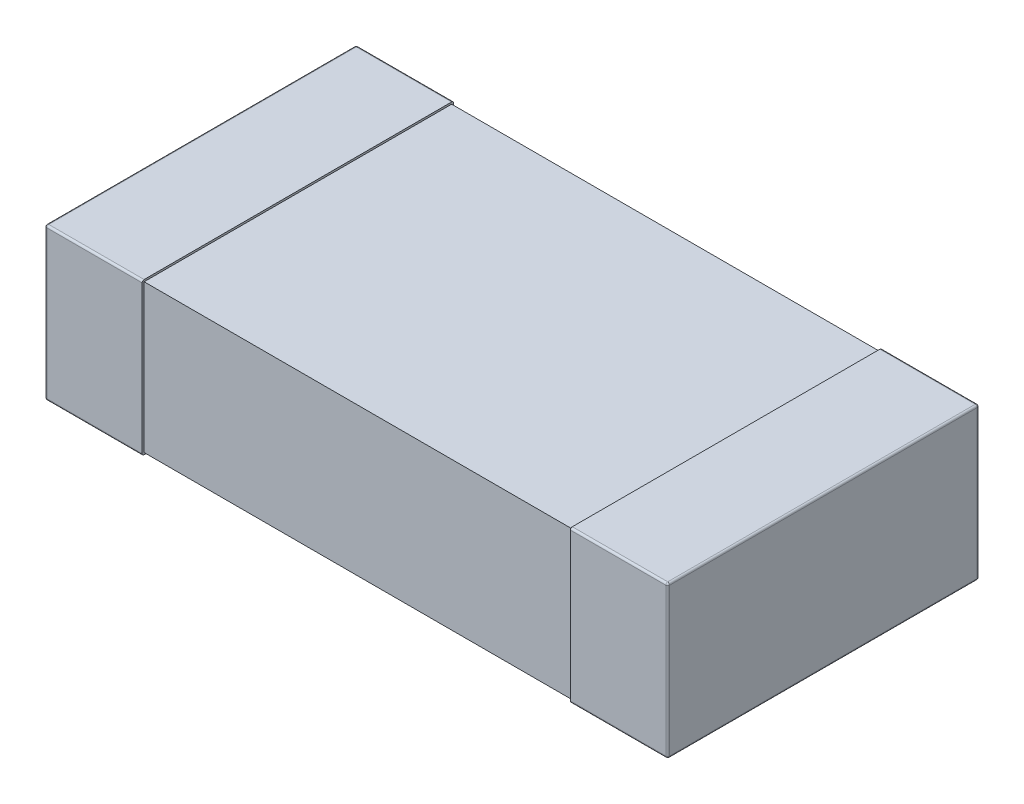
ISO-10303-21;
HEADER;
FILE_DESCRIPTION(('STEP AP214'),'2;1');
FILE_NAME('part.step','',(''),(''),'','','');
FILE_SCHEMA(('AUTOMOTIVE_DESIGN { 1 0 10303 214 1 1 1 1 }'));
ENDSEC;
DATA;
#1=APPLICATION_CONTEXT('core data for automotive mechanical design processes');
#2=APPLICATION_PROTOCOL_DEFINITION('international standard','automotive_design',2000,#1);
#3=PRODUCT_CONTEXT('',#1,'mechanical');
#4=PRODUCT('Part','Part','',(#3));
#5=PRODUCT_RELATED_PRODUCT_CATEGORY('part','',(#4));
#6=PRODUCT_DEFINITION_FORMATION('','',#4);
#7=PRODUCT_DEFINITION_CONTEXT('part definition',#1,'design');
#8=PRODUCT_DEFINITION('design','',#6,#7);
#9=PRODUCT_DEFINITION_SHAPE('','',#8);
#10=(LENGTH_UNIT() NAMED_UNIT(*) SI_UNIT(.MILLI.,.METRE.));
#11=(NAMED_UNIT(*) PLANE_ANGLE_UNIT() SI_UNIT($,.RADIAN.));
#12=(NAMED_UNIT(*) SI_UNIT($,.STERADIAN.) SOLID_ANGLE_UNIT());
#13=UNCERTAINTY_MEASURE_WITH_UNIT(LENGTH_MEASURE(1.E-05),#10,'distance_accuracy_value','');
#14=(GEOMETRIC_REPRESENTATION_CONTEXT(3) GLOBAL_UNCERTAINTY_ASSIGNED_CONTEXT((#13)) GLOBAL_UNIT_ASSIGNED_CONTEXT((#10,
#11,#12)) REPRESENTATION_CONTEXT('',''));
#15=CARTESIAN_POINT('',(0.,0.,0.));
#16=DIRECTION('',(0.,0.,1.));
#17=DIRECTION('',(1.,0.,0.));
#18=AXIS2_PLACEMENT_3D('',#15,#16,#17);
#19=CARTESIAN_POINT('',(-1.6,0.39,-0.8));
#20=DIRECTION('',(1.,0.,0.));
#21=DIRECTION('',(0.,0.,-1.));
#22=AXIS2_PLACEMENT_3D('',#19,#20,#21);
#23=PLANE('',#22);
#24=DIRECTION('',(0.,-1.,0.));
#25=VECTOR('',#24,1.);
#26=CARTESIAN_POINT('',(-1.6,0.39,-0.79));
#27=LINE('',#26,#25);
#28=CARTESIAN_POINT('',(-1.6,0.38,-0.79));
#29=VERTEX_POINT('',#28);
#30=CARTESIAN_POINT('',(-1.6,-0.38,-0.79));
#31=VERTEX_POINT('',#30);
#32=EDGE_CURVE('E11',#29,#31,#27,.T.);
#33=ORIENTED_EDGE('',*,*,#32,.T.);
#34=DIRECTION('',(0.,0.,1.));
#35=VECTOR('',#34,1.);
#36=CARTESIAN_POINT('',(-1.6,-0.38,-0.8));
#37=LINE('',#36,#35);
#38=CARTESIAN_POINT('',(-1.6,-0.38,0.79));
#39=VERTEX_POINT('',#38);
#40=EDGE_CURVE('E24',#31,#39,#37,.T.);
#41=ORIENTED_EDGE('',*,*,#40,.T.);
#42=DIRECTION('',(0.,1.,0.));
#43=VECTOR('',#42,1.);
#44=CARTESIAN_POINT('',(-1.6,0.39,0.79));
#45=LINE('',#44,#43);
#46=CARTESIAN_POINT('',(-1.6,0.38,0.79));
#47=VERTEX_POINT('',#46);
#48=EDGE_CURVE('E407',#39,#47,#45,.T.);
#49=ORIENTED_EDGE('',*,*,#48,.T.);
#50=DIRECTION('',(0.,0.,-1.));
#51=VECTOR('',#50,1.);
#52=CARTESIAN_POINT('',(-1.6,0.38,-0.8));
#53=LINE('',#52,#51);
#54=EDGE_CURVE('E405',#47,#29,#53,.T.);
#55=ORIENTED_EDGE('',*,*,#54,.T.);
#56=EDGE_LOOP('',(#33,#41,#49,#55));
#57=FACE_BOUND('',#56,.T.);
#58=ADVANCED_FACE('F17',(#57),#23,.F.);
#59=CARTESIAN_POINT('',(-1.6,0.39,0.8));
#60=DIRECTION('',(0.,0.,-1.));
#61=DIRECTION('',(-1.,0.,0.));
#62=AXIS2_PLACEMENT_3D('',#59,#60,#61);
#63=PLANE('',#62);
#64=DIRECTION('',(0.,-1.,0.));
#65=VECTOR('',#64,1.);
#66=CARTESIAN_POINT('',(-1.59,0.39,0.8));
#67=LINE('',#66,#65);
#68=CARTESIAN_POINT('',(-1.59,0.38,0.8));
#69=VERTEX_POINT('',#68);
#70=CARTESIAN_POINT('',(-1.59,-0.38,0.8));
#71=VERTEX_POINT('',#70);
#72=EDGE_CURVE('E403',#69,#71,#67,.T.);
#73=ORIENTED_EDGE('',*,*,#72,.T.);
#74=DIRECTION('',(1.,0.,0.));
#75=VECTOR('',#74,1.);
#76=CARTESIAN_POINT('',(-1.6,-0.38,0.8));
#77=LINE('',#76,#75);
#78=CARTESIAN_POINT('',(-1.1,-0.38,0.8));
#79=VERTEX_POINT('',#78);
#80=EDGE_CURVE('E401',#71,#79,#77,.T.);
#81=ORIENTED_EDGE('',*,*,#80,.T.);
#82=DIRECTION('',(0.,-1.,0.));
#83=VECTOR('',#82,1.);
#84=CARTESIAN_POINT('',(-1.1,0.39,0.8));
#85=LINE('',#84,#83);
#86=CARTESIAN_POINT('',(-1.1,0.38,0.8));
#87=VERTEX_POINT('',#86);
#88=EDGE_CURVE('E398',#87,#79,#85,.T.);
#89=ORIENTED_EDGE('',*,*,#88,.F.);
#90=DIRECTION('',(-1.,0.,0.));
#91=VECTOR('',#90,1.);
#92=CARTESIAN_POINT('',(-1.6,0.38,0.8));
#93=LINE('',#92,#91);
#94=EDGE_CURVE('E395',#87,#69,#93,.T.);
#95=ORIENTED_EDGE('',*,*,#94,.T.);
#96=EDGE_LOOP('',(#73,#81,#89,#95));
#97=FACE_BOUND('',#96,.T.);
#98=ADVANCED_FACE('F430',(#97),#63,.F.);
#99=CARTESIAN_POINT('',(-1.1,0.39,-0.8));
#100=DIRECTION('',(-1.,0.,0.));
#101=DIRECTION('',(0.,0.,1.));
#102=AXIS2_PLACEMENT_3D('',#99,#100,#101);
#103=PLANE('',#102);
#104=DIRECTION('',(0.,1.,0.));
#105=VECTOR('',#104,1.);
#106=CARTESIAN_POINT('',(-1.1,0.38,-0.79));
#107=LINE('',#106,#105);
#108=CARTESIAN_POINT('',(-1.1,-0.38,-0.79));
#109=VERTEX_POINT('',#108);
#110=CARTESIAN_POINT('',(-1.1,0.38,-0.79));
#111=VERTEX_POINT('',#110);
#112=EDGE_CURVE('E393',#109,#111,#107,.T.);
#113=ORIENTED_EDGE('',*,*,#112,.F.);
#114=DIRECTION('',(0.,0.,-1.));
#115=VECTOR('',#114,1.);
#116=CARTESIAN_POINT('',(-1.1,-0.38,0.79));
#117=LINE('',#116,#115);
#118=CARTESIAN_POINT('',(-1.1,-0.38,0.79));
#119=VERTEX_POINT('',#118);
#120=EDGE_CURVE('E390',#119,#109,#117,.T.);
#121=ORIENTED_EDGE('',*,*,#120,.F.);
#122=DIRECTION('',(0.,-1.,0.));
#123=VECTOR('',#122,1.);
#124=CARTESIAN_POINT('',(-1.1,0.38,0.79));
#125=LINE('',#124,#123);
#126=CARTESIAN_POINT('',(-1.1,0.38,0.79));
#127=VERTEX_POINT('',#126);
#128=EDGE_CURVE('E387',#127,#119,#125,.T.);
#129=ORIENTED_EDGE('',*,*,#128,.F.);
#130=DIRECTION('',(0.,0.,1.));
#131=VECTOR('',#130,1.);
#132=CARTESIAN_POINT('',(-1.1,0.38,0.79));
#133=LINE('',#132,#131);
#134=EDGE_CURVE('E384',#111,#127,#133,.T.);
#135=ORIENTED_EDGE('',*,*,#134,.F.);
#136=EDGE_LOOP('',(#113,#121,#129,#135));
#137=FACE_BOUND('',#136,.T.);
#138=DIRECTION('',(0.,0.,-1.));
#139=VECTOR('',#138,1.);
#140=CARTESIAN_POINT('',(-1.1,-0.39,-0.8));
#141=LINE('',#140,#139);
#142=CARTESIAN_POINT('',(-1.1,-0.39,0.79));
#143=VERTEX_POINT('',#142);
#144=CARTESIAN_POINT('',(-1.1,-0.39,-0.79));
#145=VERTEX_POINT('',#144);
#146=EDGE_CURVE('E382',#143,#145,#141,.T.);
#147=ORIENTED_EDGE('',*,*,#146,.T.);
#148=CARTESIAN_POINT('',(-1.1,-0.38,-0.79));
#149=DIRECTION('',(1.,0.,0.));
#150=DIRECTION('',(0.,0.,1.));
#151=AXIS2_PLACEMENT_3D('',#148,#149,#150);
#152=CIRCLE('',#151,0.01);
#153=CARTESIAN_POINT('',(-1.1,-0.38,-0.8));
#154=VERTEX_POINT('',#153);
#155=EDGE_CURVE('E380',#145,#154,#152,.T.);
#156=ORIENTED_EDGE('',*,*,#155,.T.);
#157=DIRECTION('',(0.,-1.,0.));
#158=VECTOR('',#157,1.);
#159=CARTESIAN_POINT('',(-1.1,0.39,-0.8));
#160=LINE('',#159,#158);
#161=CARTESIAN_POINT('',(-1.1,0.38,-0.8));
#162=VERTEX_POINT('',#161);
#163=EDGE_CURVE('E377',#162,#154,#160,.T.);
#164=ORIENTED_EDGE('',*,*,#163,.F.);
#165=CARTESIAN_POINT('',(-1.1,0.38,-0.79));
#166=DIRECTION('',(1.,0.,0.));
#167=DIRECTION('',(0.,0.,1.));
#168=AXIS2_PLACEMENT_3D('',#165,#166,#167);
#169=CIRCLE('',#168,0.01);
#170=CARTESIAN_POINT('',(-1.1,0.39,-0.79));
#171=VERTEX_POINT('',#170);
#172=EDGE_CURVE('E375',#162,#171,#169,.T.);
#173=ORIENTED_EDGE('',*,*,#172,.T.);
#174=DIRECTION('',(0.,0.,-1.));
#175=VECTOR('',#174,1.);
#176=CARTESIAN_POINT('',(-1.1,0.39,-0.8));
#177=LINE('',#176,#175);
#178=CARTESIAN_POINT('',(-1.1,0.39,0.79));
#179=VERTEX_POINT('',#178);
#180=EDGE_CURVE('E372',#179,#171,#177,.T.);
#181=ORIENTED_EDGE('',*,*,#180,.F.);
#182=CARTESIAN_POINT('',(-1.1,0.38,0.79));
#183=DIRECTION('',(1.,0.,0.));
#184=DIRECTION('',(0.,0.,1.));
#185=AXIS2_PLACEMENT_3D('',#182,#183,#184);
#186=CIRCLE('',#185,0.01);
#187=EDGE_CURVE('E369',#179,#87,#186,.T.);
#188=ORIENTED_EDGE('',*,*,#187,.T.);
#189=ORIENTED_EDGE('',*,*,#88,.T.);
#190=CARTESIAN_POINT('',(-1.1,-0.38,0.79));
#191=DIRECTION('',(1.,0.,0.));
#192=DIRECTION('',(0.,0.,1.));
#193=AXIS2_PLACEMENT_3D('',#190,#191,#192);
#194=CIRCLE('',#193,0.01);
#195=EDGE_CURVE('E366',#79,#143,#194,.T.);
#196=ORIENTED_EDGE('',*,*,#195,.T.);
#197=EDGE_LOOP('',(#147,#156,#164,#173,#181,#188,#189,#196));
#198=FACE_BOUND('',#197,.T.);
#199=ADVANCED_FACE('F433',(#137,#198),#103,.F.);
#200=CARTESIAN_POINT('',(-1.6,0.39,-0.8));
#201=DIRECTION('',(0.,0.,1.));
#202=DIRECTION('',(1.,0.,0.));
#203=AXIS2_PLACEMENT_3D('',#200,#201,#202);
#204=PLANE('',#203);
#205=ORIENTED_EDGE('',*,*,#163,.T.);
#206=DIRECTION('',(-1.,0.,0.));
#207=VECTOR('',#206,1.);
#208=CARTESIAN_POINT('',(-1.6,-0.38,-0.8));
#209=LINE('',#208,#207);
#210=CARTESIAN_POINT('',(-1.59,-0.38,-0.8));
#211=VERTEX_POINT('',#210);
#212=EDGE_CURVE('E364',#154,#211,#209,.T.);
#213=ORIENTED_EDGE('',*,*,#212,.T.);
#214=DIRECTION('',(0.,1.,0.));
#215=VECTOR('',#214,1.);
#216=CARTESIAN_POINT('',(-1.59,0.39,-0.8));
#217=LINE('',#216,#215);
#218=CARTESIAN_POINT('',(-1.59,0.38,-0.8));
#219=VERTEX_POINT('',#218);
#220=EDGE_CURVE('E362',#211,#219,#217,.T.);
#221=ORIENTED_EDGE('',*,*,#220,.T.);
#222=DIRECTION('',(1.,0.,0.));
#223=VECTOR('',#222,1.);
#224=CARTESIAN_POINT('',(-1.1,0.38,-0.8));
#225=LINE('',#224,#223);
#226=EDGE_CURVE('E359',#219,#162,#225,.T.);
#227=ORIENTED_EDGE('',*,*,#226,.T.);
#228=EDGE_LOOP('',(#205,#213,#221,#227));
#229=FACE_BOUND('',#228,.T.);
#230=ADVANCED_FACE('F481',(#229),#204,.F.);
#231=CARTESIAN_POINT('',(-1.6,0.39,0.8));
#232=DIRECTION('',(0.,1.,0.));
#233=DIRECTION('',(0.,0.,1.));
#234=AXIS2_PLACEMENT_3D('',#231,#232,#233);
#235=PLANE('',#234);
#236=ORIENTED_EDGE('',*,*,#180,.T.);
#237=DIRECTION('',(-1.,0.,0.));
#238=VECTOR('',#237,1.);
#239=CARTESIAN_POINT('',(-1.6,0.39,-0.79));
#240=LINE('',#239,#238);
#241=CARTESIAN_POINT('',(-1.59,0.39,-0.79));
#242=VERTEX_POINT('',#241);
#243=EDGE_CURVE('E357',#171,#242,#240,.T.);
#244=ORIENTED_EDGE('',*,*,#243,.T.);
#245=DIRECTION('',(0.,0.,1.));
#246=VECTOR('',#245,1.);
#247=CARTESIAN_POINT('',(-1.59,0.39,0.8));
#248=LINE('',#247,#246);
#249=CARTESIAN_POINT('',(-1.59,0.39,0.79));
#250=VERTEX_POINT('',#249);
#251=EDGE_CURVE('E355',#242,#250,#248,.T.);
#252=ORIENTED_EDGE('',*,*,#251,.T.);
#253=DIRECTION('',(1.,0.,0.));
#254=VECTOR('',#253,1.);
#255=CARTESIAN_POINT('',(-1.1,0.39,0.79));
#256=LINE('',#255,#254);
#257=EDGE_CURVE('E352',#250,#179,#256,.T.);
#258=ORIENTED_EDGE('',*,*,#257,.T.);
#259=EDGE_LOOP('',(#236,#244,#252,#258));
#260=FACE_BOUND('',#259,.T.);
#261=ADVANCED_FACE('F441',(#260),#235,.T.);
#262=CARTESIAN_POINT('',(-1.6,-0.39,0.8));
#263=DIRECTION('',(0.,1.,0.));
#264=DIRECTION('',(0.,0.,1.));
#265=AXIS2_PLACEMENT_3D('',#262,#263,#264);
#266=PLANE('',#265);
#267=DIRECTION('',(0.,0.,-1.));
#268=VECTOR('',#267,1.);
#269=CARTESIAN_POINT('',(-1.59,-0.39,0.8));
#270=LINE('',#269,#268);
#271=CARTESIAN_POINT('',(-1.59,-0.39,0.79));
#272=VERTEX_POINT('',#271);
#273=CARTESIAN_POINT('',(-1.59,-0.39,-0.79));
#274=VERTEX_POINT('',#273);
#275=EDGE_CURVE('E350',#272,#274,#270,.T.);
#276=ORIENTED_EDGE('',*,*,#275,.T.);
#277=DIRECTION('',(1.,0.,0.));
#278=VECTOR('',#277,1.);
#279=CARTESIAN_POINT('',(-1.6,-0.39,-0.79));
#280=LINE('',#279,#278);
#281=EDGE_CURVE('E347',#274,#145,#280,.T.);
#282=ORIENTED_EDGE('',*,*,#281,.T.);
#283=ORIENTED_EDGE('',*,*,#146,.F.);
#284=DIRECTION('',(-1.,0.,0.));
#285=VECTOR('',#284,1.);
#286=CARTESIAN_POINT('',(-1.6,-0.39,0.79));
#287=LINE('',#286,#285);
#288=EDGE_CURVE('E344',#143,#272,#287,.T.);
#289=ORIENTED_EDGE('',*,*,#288,.T.);
#290=EDGE_LOOP('',(#276,#282,#283,#289));
#291=FACE_BOUND('',#290,.T.);
#292=ADVANCED_FACE('F424',(#291),#266,.F.);
#293=CARTESIAN_POINT('',(-1.6,0.38,-0.79));
#294=DIRECTION('',(1.,0.,0.));
#295=DIRECTION('',(0.,0.,-1.));
#296=AXIS2_PLACEMENT_3D('',#293,#294,#295);
#297=CYLINDRICAL_SURFACE('',#296,0.01);
#298=ORIENTED_EDGE('',*,*,#172,.F.);
#299=ORIENTED_EDGE('',*,*,#226,.F.);
#300=CARTESIAN_POINT('',(-1.59,0.38,-0.79));
#301=DIRECTION('',(-1.,0.,0.));
#302=DIRECTION('',(0.,0.,1.));
#303=AXIS2_PLACEMENT_3D('',#300,#301,#302);
#304=CIRCLE('',#303,0.01);
#305=EDGE_CURVE('E341',#242,#219,#304,.T.);
#306=ORIENTED_EDGE('',*,*,#305,.F.);
#307=ORIENTED_EDGE('',*,*,#243,.F.);
#308=EDGE_LOOP('',(#298,#299,#306,#307));
#309=FACE_BOUND('',#308,.T.);
#310=ADVANCED_FACE('F452',(#309),#297,.T.);
#311=CARTESIAN_POINT('',(-1.59,0.38,0.8));
#312=DIRECTION('',(0.,0.,-1.));
#313=DIRECTION('',(-1.,0.,0.));
#314=AXIS2_PLACEMENT_3D('',#311,#312,#313);
#315=CYLINDRICAL_SURFACE('',#314,0.01);
#316=CARTESIAN_POINT('',(-1.59,0.38,0.79));
#317=DIRECTION('',(0.,0.,1.));
#318=DIRECTION('',(1.,0.,0.));
#319=AXIS2_PLACEMENT_3D('',#316,#317,#318);
#320=CIRCLE('',#319,0.01);
#321=EDGE_CURVE('E338',#250,#47,#320,.T.);
#322=ORIENTED_EDGE('',*,*,#321,.F.);
#323=ORIENTED_EDGE('',*,*,#251,.F.);
#324=CARTESIAN_POINT('',(-1.59,0.38,-0.79));
#325=DIRECTION('',(0.,0.,-1.));
#326=DIRECTION('',(-1.,0.,0.));
#327=AXIS2_PLACEMENT_3D('',#324,#325,#326);
#328=CIRCLE('',#327,0.01);
#329=EDGE_CURVE('E335',#29,#242,#328,.T.);
#330=ORIENTED_EDGE('',*,*,#329,.F.);
#331=ORIENTED_EDGE('',*,*,#54,.F.);
#332=EDGE_LOOP('',(#322,#323,#330,#331));
#333=FACE_BOUND('',#332,.T.);
#334=ADVANCED_FACE('F447',(#333),#315,.T.);
#335=CARTESIAN_POINT('',(-1.6,0.38,0.79));
#336=DIRECTION('',(-1.,0.,0.));
#337=DIRECTION('',(0.,0.,1.));
#338=AXIS2_PLACEMENT_3D('',#335,#336,#337);
#339=CYLINDRICAL_SURFACE('',#338,0.01);
#340=ORIENTED_EDGE('',*,*,#187,.F.);
#341=ORIENTED_EDGE('',*,*,#257,.F.);
#342=CARTESIAN_POINT('',(-1.59,0.38,0.79));
#343=DIRECTION('',(-1.,0.,0.));
#344=DIRECTION('',(0.,0.,1.));
#345=AXIS2_PLACEMENT_3D('',#342,#343,#344);
#346=CIRCLE('',#345,0.01);
#347=EDGE_CURVE('E332',#69,#250,#346,.T.);
#348=ORIENTED_EDGE('',*,*,#347,.F.);
#349=ORIENTED_EDGE('',*,*,#94,.F.);
#350=EDGE_LOOP('',(#340,#341,#348,#349));
#351=FACE_BOUND('',#350,.T.);
#352=ADVANCED_FACE('F437',(#351),#339,.T.);
#353=CARTESIAN_POINT('',(-1.59,0.38,-0.79));
#354=DIRECTION('',(0.,1.,0.));
#355=DIRECTION('',(1.,0.,0.));
#356=AXIS2_PLACEMENT_3D('',#353,#354,#355);
#357=SPHERICAL_SURFACE('',#356,0.01);
#358=ORIENTED_EDGE('',*,*,#329,.T.);
#359=ORIENTED_EDGE('',*,*,#305,.T.);
#360=CARTESIAN_POINT('',(-1.59,0.38,-0.79));
#361=DIRECTION('',(0.,-1.,0.));
#362=DIRECTION('',(0.,0.,1.));
#363=AXIS2_PLACEMENT_3D('',#360,#361,#362);
#364=CIRCLE('',#363,0.01);
#365=EDGE_CURVE('E330',#29,#219,#364,.T.);
#366=ORIENTED_EDGE('',*,*,#365,.F.);
#367=EDGE_LOOP('',(#358,#359,#366));
#368=FACE_BOUND('',#367,.T.);
#369=ADVANCED_FACE('F454',(#368),#357,.T.);
#370=CARTESIAN_POINT('',(-1.59,0.38,0.79));
#371=DIRECTION('',(0.,1.,0.));
#372=DIRECTION('',(1.,0.,0.));
#373=AXIS2_PLACEMENT_3D('',#370,#371,#372);
#374=SPHERICAL_SURFACE('',#373,0.01);
#375=ORIENTED_EDGE('',*,*,#347,.T.);
#376=ORIENTED_EDGE('',*,*,#321,.T.);
#377=CARTESIAN_POINT('',(-1.59,0.38,0.79));
#378=DIRECTION('',(0.,-1.,0.));
#379=DIRECTION('',(0.,0.,1.));
#380=AXIS2_PLACEMENT_3D('',#377,#378,#379);
#381=CIRCLE('',#380,0.01);
#382=EDGE_CURVE('E327',#69,#47,#381,.T.);
#383=ORIENTED_EDGE('',*,*,#382,.F.);
#384=EDGE_LOOP('',(#375,#376,#383));
#385=FACE_BOUND('',#384,.T.);
#386=ADVANCED_FACE('F499',(#385),#374,.T.);
#387=CARTESIAN_POINT('',(-1.6,-0.38,-0.79));
#388=DIRECTION('',(-1.,0.,0.));
#389=DIRECTION('',(0.,0.,1.));
#390=AXIS2_PLACEMENT_3D('',#387,#388,#389);
#391=CYLINDRICAL_SURFACE('',#390,0.01);
#392=ORIENTED_EDGE('',*,*,#155,.F.);
#393=ORIENTED_EDGE('',*,*,#281,.F.);
#394=CARTESIAN_POINT('',(-1.59,-0.38,-0.79));
#395=DIRECTION('',(-1.,0.,0.));
#396=DIRECTION('',(0.,0.,1.));
#397=AXIS2_PLACEMENT_3D('',#394,#395,#396);
#398=CIRCLE('',#397,0.01);
#399=EDGE_CURVE('E324',#211,#274,#398,.T.);
#400=ORIENTED_EDGE('',*,*,#399,.F.);
#401=ORIENTED_EDGE('',*,*,#212,.F.);
#402=EDGE_LOOP('',(#392,#393,#400,#401));
#403=FACE_BOUND('',#402,.T.);
#404=ADVANCED_FACE('F462',(#403),#391,.T.);
#405=CARTESIAN_POINT('',(-1.59,0.39,-0.79));
#406=DIRECTION('',(0.,-1.,0.));
#407=DIRECTION('',(0.,0.,-1.));
#408=AXIS2_PLACEMENT_3D('',#405,#406,#407);
#409=CYLINDRICAL_SURFACE('',#408,0.01);
#410=ORIENTED_EDGE('',*,*,#365,.T.);
#411=ORIENTED_EDGE('',*,*,#220,.F.);
#412=CARTESIAN_POINT('',(-1.59,-0.38,-0.79));
#413=DIRECTION('',(0.,-1.,0.));
#414=DIRECTION('',(0.,0.,-1.));
#415=AXIS2_PLACEMENT_3D('',#412,#413,#414);
#416=CIRCLE('',#415,0.01);
#417=EDGE_CURVE('E321',#31,#211,#416,.T.);
#418=ORIENTED_EDGE('',*,*,#417,.F.);
#419=ORIENTED_EDGE('',*,*,#32,.F.);
#420=EDGE_LOOP('',(#410,#411,#418,#419));
#421=FACE_BOUND('',#420,.T.);
#422=ADVANCED_FACE('F456',(#421),#409,.T.);
#423=CARTESIAN_POINT('',(-1.59,0.39,0.79));
#424=DIRECTION('',(0.,-1.,0.));
#425=DIRECTION('',(0.,0.,-1.));
#426=AXIS2_PLACEMENT_3D('',#423,#424,#425);
#427=CYLINDRICAL_SURFACE('',#426,0.01);
#428=ORIENTED_EDGE('',*,*,#382,.T.);
#429=ORIENTED_EDGE('',*,*,#48,.F.);
#430=CARTESIAN_POINT('',(-1.59,-0.38,0.79));
#431=DIRECTION('',(0.,-1.,0.));
#432=DIRECTION('',(0.,0.,-1.));
#433=AXIS2_PLACEMENT_3D('',#430,#431,#432);
#434=CIRCLE('',#433,0.01);
#435=EDGE_CURVE('E318',#71,#39,#434,.T.);
#436=ORIENTED_EDGE('',*,*,#435,.F.);
#437=ORIENTED_EDGE('',*,*,#72,.F.);
#438=EDGE_LOOP('',(#428,#429,#436,#437));
#439=FACE_BOUND('',#438,.T.);
#440=ADVANCED_FACE('F413',(#439),#427,.T.);
#441=CARTESIAN_POINT('',(-1.6,-0.38,0.79));
#442=DIRECTION('',(1.,0.,0.));
#443=DIRECTION('',(0.,0.,-1.));
#444=AXIS2_PLACEMENT_3D('',#441,#442,#443);
#445=CYLINDRICAL_SURFACE('',#444,0.01);
#446=ORIENTED_EDGE('',*,*,#195,.F.);
#447=ORIENTED_EDGE('',*,*,#80,.F.);
#448=CARTESIAN_POINT('',(-1.59,-0.38,0.79));
#449=DIRECTION('',(-1.,0.,0.));
#450=DIRECTION('',(0.,0.,1.));
#451=AXIS2_PLACEMENT_3D('',#448,#449,#450);
#452=CIRCLE('',#451,0.01);
#453=EDGE_CURVE('E315',#272,#71,#452,.T.);
#454=ORIENTED_EDGE('',*,*,#453,.F.);
#455=ORIENTED_EDGE('',*,*,#288,.F.);
#456=EDGE_LOOP('',(#446,#447,#454,#455));
#457=FACE_BOUND('',#456,.T.);
#458=ADVANCED_FACE('F428',(#457),#445,.T.);
#459=CARTESIAN_POINT('',(-1.59,-0.38,-0.79));
#460=DIRECTION('',(0.,1.,0.));
#461=DIRECTION('',(1.,0.,0.));
#462=AXIS2_PLACEMENT_3D('',#459,#460,#461);
#463=SPHERICAL_SURFACE('',#462,0.01);
#464=ORIENTED_EDGE('',*,*,#417,.T.);
#465=ORIENTED_EDGE('',*,*,#399,.T.);
#466=CARTESIAN_POINT('',(-1.59,-0.38,-0.79));
#467=DIRECTION('',(0.,0.,1.));
#468=DIRECTION('',(-1.,0.,0.));
#469=AXIS2_PLACEMENT_3D('',#466,#467,#468);
#470=CIRCLE('',#469,0.01);
#471=EDGE_CURVE('E312',#31,#274,#470,.T.);
#472=ORIENTED_EDGE('',*,*,#471,.F.);
#473=EDGE_LOOP('',(#464,#465,#472));
#474=FACE_BOUND('',#473,.T.);
#475=ADVANCED_FACE('F464',(#474),#463,.T.);
#476=CARTESIAN_POINT('',(-1.59,-0.38,0.79));
#477=DIRECTION('',(0.,1.,0.));
#478=DIRECTION('',(1.,0.,0.));
#479=AXIS2_PLACEMENT_3D('',#476,#477,#478);
#480=SPHERICAL_SURFACE('',#479,0.01);
#481=ORIENTED_EDGE('',*,*,#453,.T.);
#482=ORIENTED_EDGE('',*,*,#435,.T.);
#483=CARTESIAN_POINT('',(-1.59,-0.38,0.79));
#484=DIRECTION('',(0.,0.,-1.));
#485=DIRECTION('',(1.,0.,0.));
#486=AXIS2_PLACEMENT_3D('',#483,#484,#485);
#487=CIRCLE('',#486,0.01);
#488=EDGE_CURVE('E309',#272,#39,#487,.T.);
#489=ORIENTED_EDGE('',*,*,#488,.F.);
#490=EDGE_LOOP('',(#481,#482,#489));
#491=FACE_BOUND('',#490,.T.);
#492=ADVANCED_FACE('F417',(#491),#480,.T.);
#493=CARTESIAN_POINT('',(-1.59,-0.38,-0.8));
#494=DIRECTION('',(0.,0.,1.));
#495=DIRECTION('',(1.,0.,0.));
#496=AXIS2_PLACEMENT_3D('',#493,#494,#495);
#497=CYLINDRICAL_SURFACE('',#496,0.01);
#498=ORIENTED_EDGE('',*,*,#471,.T.);
#499=ORIENTED_EDGE('',*,*,#275,.F.);
#500=ORIENTED_EDGE('',*,*,#488,.T.);
#501=ORIENTED_EDGE('',*,*,#40,.F.);
#502=EDGE_LOOP('',(#498,#499,#500,#501));
#503=FACE_BOUND('',#502,.T.);
#504=ADVANCED_FACE('F419',(#503),#497,.T.);
#505=CARTESIAN_POINT('',(-2.85328263551545,-0.38,0.79));
#506=DIRECTION('',(0.,-1.,0.));
#507=DIRECTION('',(0.,0.,-1.));
#508=AXIS2_PLACEMENT_3D('',#505,#506,#507);
#509=PLANE('',#508);
#510=DIRECTION('',(1.,0.,0.));
#511=VECTOR('',#510,1.);
#512=CARTESIAN_POINT('',(-2.85328263551545,-0.38,0.79));
#513=LINE('',#512,#511);
#514=CARTESIAN_POINT('',(1.1,-0.38,0.79));
#515=VERTEX_POINT('',#514);
#516=EDGE_CURVE('E307',#119,#515,#513,.T.);
#517=ORIENTED_EDGE('',*,*,#516,.F.);
#518=ORIENTED_EDGE('',*,*,#120,.T.);
#519=DIRECTION('',(1.,0.,0.));
#520=VECTOR('',#519,1.);
#521=CARTESIAN_POINT('',(-2.85328263551545,-0.38,-0.79));
#522=LINE('',#521,#520);
#523=CARTESIAN_POINT('',(1.1,-0.38,-0.79));
#524=VERTEX_POINT('',#523);
#525=EDGE_CURVE('E305',#109,#524,#522,.T.);
#526=ORIENTED_EDGE('',*,*,#525,.T.);
#527=DIRECTION('',(0.,0.,-1.));
#528=VECTOR('',#527,1.);
#529=CARTESIAN_POINT('',(1.1,-0.38,0.79));
#530=LINE('',#529,#528);
#531=EDGE_CURVE('E302',#515,#524,#530,.T.);
#532=ORIENTED_EDGE('',*,*,#531,.F.);
#533=EDGE_LOOP('',(#517,#518,#526,#532));
#534=FACE_BOUND('',#533,.T.);
#535=ADVANCED_FACE('F543',(#534),#509,.T.);
#536=CARTESIAN_POINT('',(-2.85328263551545,0.38,-0.79));
#537=DIRECTION('',(0.,0.,-1.));
#538=DIRECTION('',(-1.,0.,0.));
#539=AXIS2_PLACEMENT_3D('',#536,#537,#538);
#540=PLANE('',#539);
#541=ORIENTED_EDGE('',*,*,#525,.F.);
#542=ORIENTED_EDGE('',*,*,#112,.T.);
#543=DIRECTION('',(1.,0.,0.));
#544=VECTOR('',#543,1.);
#545=CARTESIAN_POINT('',(-2.85328263551545,0.38,-0.79));
#546=LINE('',#545,#544);
#547=CARTESIAN_POINT('',(1.1,0.38,-0.79));
#548=VERTEX_POINT('',#547);
#549=EDGE_CURVE('E300',#111,#548,#546,.T.);
#550=ORIENTED_EDGE('',*,*,#549,.T.);
#551=DIRECTION('',(0.,1.,0.));
#552=VECTOR('',#551,1.);
#553=CARTESIAN_POINT('',(1.1,0.38,-0.79));
#554=LINE('',#553,#552);
#555=EDGE_CURVE('E297',#524,#548,#554,.T.);
#556=ORIENTED_EDGE('',*,*,#555,.F.);
#557=EDGE_LOOP('',(#541,#542,#550,#556));
#558=FACE_BOUND('',#557,.T.);
#559=ADVANCED_FACE('F553',(#558),#540,.T.);
#560=CARTESIAN_POINT('',(-2.85328263551545,0.38,0.79));
#561=DIRECTION('',(0.,1.,0.));
#562=DIRECTION('',(0.,0.,1.));
#563=AXIS2_PLACEMENT_3D('',#560,#561,#562);
#564=PLANE('',#563);
#565=ORIENTED_EDGE('',*,*,#549,.F.);
#566=ORIENTED_EDGE('',*,*,#134,.T.);
#567=DIRECTION('',(1.,0.,0.));
#568=VECTOR('',#567,1.);
#569=CARTESIAN_POINT('',(-2.85328263551545,0.38,0.79));
#570=LINE('',#569,#568);
#571=CARTESIAN_POINT('',(1.1,0.38,0.79));
#572=VERTEX_POINT('',#571);
#573=EDGE_CURVE('E295',#127,#572,#570,.T.);
#574=ORIENTED_EDGE('',*,*,#573,.T.);
#575=DIRECTION('',(0.,0.,1.));
#576=VECTOR('',#575,1.);
#577=CARTESIAN_POINT('',(1.1,0.38,0.79));
#578=LINE('',#577,#576);
#579=EDGE_CURVE('E292',#548,#572,#578,.T.);
#580=ORIENTED_EDGE('',*,*,#579,.F.);
#581=EDGE_LOOP('',(#565,#566,#574,#580));
#582=FACE_BOUND('',#581,.T.);
#583=ADVANCED_FACE('F566',(#582),#564,.T.);
#584=CARTESIAN_POINT('',(-2.85328263551545,0.38,0.79));
#585=DIRECTION('',(0.,0.,1.));
#586=DIRECTION('',(1.,0.,0.));
#587=AXIS2_PLACEMENT_3D('',#584,#585,#586);
#588=PLANE('',#587);
#589=ORIENTED_EDGE('',*,*,#573,.F.);
#590=ORIENTED_EDGE('',*,*,#128,.T.);
#591=ORIENTED_EDGE('',*,*,#516,.T.);
#592=DIRECTION('',(0.,-1.,0.));
#593=VECTOR('',#592,1.);
#594=CARTESIAN_POINT('',(1.1,0.38,0.79));
#595=LINE('',#594,#593);
#596=EDGE_CURVE('E289',#572,#515,#595,.T.);
#597=ORIENTED_EDGE('',*,*,#596,.F.);
#598=EDGE_LOOP('',(#589,#590,#591,#597));
#599=FACE_BOUND('',#598,.T.);
#600=ADVANCED_FACE('F577',(#599),#588,.T.);
#601=CARTESIAN_POINT('',(1.6,0.39,-0.8));
#602=DIRECTION('',(-1.,0.,0.));
#603=DIRECTION('',(0.,0.,-1.));
#604=AXIS2_PLACEMENT_3D('',#601,#602,#603);
#605=PLANE('',#604);
#606=DIRECTION('',(0.,-1.,0.));
#607=VECTOR('',#606,1.);
#608=CARTESIAN_POINT('',(1.6,0.39,-0.79));
#609=LINE('',#608,#607);
#610=CARTESIAN_POINT('',(1.6,0.38,-0.79));
#611=VERTEX_POINT('',#610);
#612=CARTESIAN_POINT('',(1.6,-0.38,-0.79));
#613=VERTEX_POINT('',#612);
#614=EDGE_CURVE('E287',#611,#613,#609,.T.);
#615=ORIENTED_EDGE('',*,*,#614,.F.);
#616=DIRECTION('',(0.,0.,-1.));
#617=VECTOR('',#616,1.);
#618=CARTESIAN_POINT('',(1.6,0.38,-0.8));
#619=LINE('',#618,#617);
#620=CARTESIAN_POINT('',(1.6,0.38,0.79));
#621=VERTEX_POINT('',#620);
#622=EDGE_CURVE('E284',#621,#611,#619,.T.);
#623=ORIENTED_EDGE('',*,*,#622,.F.);
#624=DIRECTION('',(0.,1.,0.));
#625=VECTOR('',#624,1.);
#626=CARTESIAN_POINT('',(1.6,0.39,0.79));
#627=LINE('',#626,#625);
#628=CARTESIAN_POINT('',(1.6,-0.38,0.79));
#629=VERTEX_POINT('',#628);
#630=EDGE_CURVE('E281',#629,#621,#627,.T.);
#631=ORIENTED_EDGE('',*,*,#630,.F.);
#632=DIRECTION('',(0.,0.,1.));
#633=VECTOR('',#632,1.);
#634=CARTESIAN_POINT('',(1.6,-0.38,-0.8));
#635=LINE('',#634,#633);
#636=EDGE_CURVE('E279',#613,#629,#635,.T.);
#637=ORIENTED_EDGE('',*,*,#636,.F.);
#638=EDGE_LOOP('',(#615,#623,#631,#637));
#639=FACE_BOUND('',#638,.T.);
#640=ADVANCED_FACE('F588',(#639),#605,.F.);
#641=CARTESIAN_POINT('',(1.6,0.39,0.8));
#642=DIRECTION('',(0.,0.,-1.));
#643=DIRECTION('',(1.,0.,0.));
#644=AXIS2_PLACEMENT_3D('',#641,#642,#643);
#645=PLANE('',#644);
#646=DIRECTION('',(0.,-1.,0.));
#647=VECTOR('',#646,1.);
#648=CARTESIAN_POINT('',(1.59,0.39,0.8));
#649=LINE('',#648,#647);
#650=CARTESIAN_POINT('',(1.59,0.38,0.8));
#651=VERTEX_POINT('',#650);
#652=CARTESIAN_POINT('',(1.59,-0.38,0.8));
#653=VERTEX_POINT('',#652);
#654=EDGE_CURVE('E277',#651,#653,#649,.T.);
#655=ORIENTED_EDGE('',*,*,#654,.F.);
#656=DIRECTION('',(1.,0.,0.));
#657=VECTOR('',#656,1.);
#658=CARTESIAN_POINT('',(1.6,0.38,0.8));
#659=LINE('',#658,#657);
#660=CARTESIAN_POINT('',(1.1,0.38,0.8));
#661=VERTEX_POINT('',#660);
#662=EDGE_CURVE('E274',#661,#651,#659,.T.);
#663=ORIENTED_EDGE('',*,*,#662,.F.);
#664=DIRECTION('',(0.,-1.,0.));
#665=VECTOR('',#664,1.);
#666=CARTESIAN_POINT('',(1.1,0.39,0.8));
#667=LINE('',#666,#665);
#668=CARTESIAN_POINT('',(1.1,-0.38,0.8));
#669=VERTEX_POINT('',#668);
#670=EDGE_CURVE('E272',#661,#669,#667,.T.);
#671=ORIENTED_EDGE('',*,*,#670,.T.);
#672=DIRECTION('',(-1.,0.,0.));
#673=VECTOR('',#672,1.);
#674=CARTESIAN_POINT('',(1.6,-0.38,0.8));
#675=LINE('',#674,#673);
#676=EDGE_CURVE('E269',#653,#669,#675,.T.);
#677=ORIENTED_EDGE('',*,*,#676,.F.);
#678=EDGE_LOOP('',(#655,#663,#671,#677));
#679=FACE_BOUND('',#678,.T.);
#680=ADVANCED_FACE('F598',(#679),#645,.F.);
#681=CARTESIAN_POINT('',(1.1,0.39,-0.8));
#682=DIRECTION('',(1.,0.,0.));
#683=DIRECTION('',(0.,0.,1.));
#684=AXIS2_PLACEMENT_3D('',#681,#682,#683);
#685=PLANE('',#684);
#686=ORIENTED_EDGE('',*,*,#555,.T.);
#687=ORIENTED_EDGE('',*,*,#579,.T.);
#688=ORIENTED_EDGE('',*,*,#596,.T.);
#689=ORIENTED_EDGE('',*,*,#531,.T.);
#690=EDGE_LOOP('',(#686,#687,#688,#689));
#691=FACE_BOUND('',#690,.T.);
#692=DIRECTION('',(0.,0.,-1.));
#693=VECTOR('',#692,1.);
#694=CARTESIAN_POINT('',(1.1,-0.39,-0.8));
#695=LINE('',#694,#693);
#696=CARTESIAN_POINT('',(1.1,-0.39,0.79));
#697=VERTEX_POINT('',#696);
#698=CARTESIAN_POINT('',(1.1,-0.39,-0.79));
#699=VERTEX_POINT('',#698);
#700=EDGE_CURVE('E192',#697,#699,#695,.T.);
#701=ORIENTED_EDGE('',*,*,#700,.F.);
#702=CARTESIAN_POINT('',(1.1,-0.38,0.79));
#703=DIRECTION('',(1.,0.,0.));
#704=DIRECTION('',(0.,0.,1.));
#705=AXIS2_PLACEMENT_3D('',#702,#703,#704);
#706=CIRCLE('',#705,0.01);
#707=EDGE_CURVE('E265',#669,#697,#706,.T.);
#708=ORIENTED_EDGE('',*,*,#707,.F.);
#709=ORIENTED_EDGE('',*,*,#670,.F.);
#710=CARTESIAN_POINT('',(1.1,0.38,0.79));
#711=DIRECTION('',(1.,0.,0.));
#712=DIRECTION('',(0.,0.,1.));
#713=AXIS2_PLACEMENT_3D('',#710,#711,#712);
#714=CIRCLE('',#713,0.01);
#715=CARTESIAN_POINT('',(1.1,0.39,0.79));
#716=VERTEX_POINT('',#715);
#717=EDGE_CURVE('E262',#716,#661,#714,.T.);
#718=ORIENTED_EDGE('',*,*,#717,.F.);
#719=DIRECTION('',(0.,0.,-1.));
#720=VECTOR('',#719,1.);
#721=CARTESIAN_POINT('',(1.1,0.39,-0.8));
#722=LINE('',#721,#720);
#723=CARTESIAN_POINT('',(1.1,0.39,-0.79));
#724=VERTEX_POINT('',#723);
#725=EDGE_CURVE('E260',#716,#724,#722,.T.);
#726=ORIENTED_EDGE('',*,*,#725,.T.);
#727=CARTESIAN_POINT('',(1.1,0.38,-0.79));
#728=DIRECTION('',(1.,0.,0.));
#729=DIRECTION('',(0.,0.,1.));
#730=AXIS2_PLACEMENT_3D('',#727,#728,#729);
#731=CIRCLE('',#730,0.01);
#732=CARTESIAN_POINT('',(1.1,0.38,-0.8));
#733=VERTEX_POINT('',#732);
#734=EDGE_CURVE('E257',#733,#724,#731,.T.);
#735=ORIENTED_EDGE('',*,*,#734,.F.);
#736=DIRECTION('',(0.,-1.,0.));
#737=VECTOR('',#736,1.);
#738=CARTESIAN_POINT('',(1.1,0.39,-0.8));
#739=LINE('',#738,#737);
#740=CARTESIAN_POINT('',(1.1,-0.38,-0.8));
#741=VERTEX_POINT('',#740);
#742=EDGE_CURVE('E255',#733,#741,#739,.T.);
#743=ORIENTED_EDGE('',*,*,#742,.T.);
#744=CARTESIAN_POINT('',(1.1,-0.38,-0.79));
#745=DIRECTION('',(1.,0.,0.));
#746=DIRECTION('',(0.,0.,1.));
#747=AXIS2_PLACEMENT_3D('',#744,#745,#746);
#748=CIRCLE('',#747,0.01);
#749=EDGE_CURVE('E253',#699,#741,#748,.T.);
#750=ORIENTED_EDGE('',*,*,#749,.F.);
#751=EDGE_LOOP('',(#701,#708,#709,#718,#726,#735,#743,#750));
#752=FACE_BOUND('',#751,.T.);
#753=ADVANCED_FACE('F608',(#691,#752),#685,.F.);
#754=CARTESIAN_POINT('',(1.6,0.39,-0.8));
#755=DIRECTION('',(0.,0.,1.));
#756=DIRECTION('',(-1.,0.,0.));
#757=AXIS2_PLACEMENT_3D('',#754,#755,#756);
#758=PLANE('',#757);
#759=ORIENTED_EDGE('',*,*,#742,.F.);
#760=DIRECTION('',(-1.,0.,0.));
#761=VECTOR('',#760,1.);
#762=CARTESIAN_POINT('',(1.1,0.38,-0.8));
#763=LINE('',#762,#761);
#764=CARTESIAN_POINT('',(1.59,0.38,-0.8));
#765=VERTEX_POINT('',#764);
#766=EDGE_CURVE('E250',#765,#733,#763,.T.);
#767=ORIENTED_EDGE('',*,*,#766,.F.);
#768=DIRECTION('',(0.,1.,0.));
#769=VECTOR('',#768,1.);
#770=CARTESIAN_POINT('',(1.59,0.39,-0.8));
#771=LINE('',#770,#769);
#772=CARTESIAN_POINT('',(1.59,-0.38,-0.8));
#773=VERTEX_POINT('',#772);
#774=EDGE_CURVE('E247',#773,#765,#771,.T.);
#775=ORIENTED_EDGE('',*,*,#774,.F.);
#776=DIRECTION('',(1.,0.,0.));
#777=VECTOR('',#776,1.);
#778=CARTESIAN_POINT('',(1.6,-0.38,-0.8));
#779=LINE('',#778,#777);
#780=EDGE_CURVE('E203',#741,#773,#779,.T.);
#781=ORIENTED_EDGE('',*,*,#780,.F.);
#782=EDGE_LOOP('',(#759,#767,#775,#781));
#783=FACE_BOUND('',#782,.T.);
#784=ADVANCED_FACE('F618',(#783),#758,.F.);
#785=CARTESIAN_POINT('',(1.6,0.39,0.8));
#786=DIRECTION('',(0.,1.,0.));
#787=DIRECTION('',(0.,0.,1.));
#788=AXIS2_PLACEMENT_3D('',#785,#786,#787);
#789=PLANE('',#788);
#790=ORIENTED_EDGE('',*,*,#725,.F.);
#791=DIRECTION('',(-1.,0.,0.));
#792=VECTOR('',#791,1.);
#793=CARTESIAN_POINT('',(1.1,0.39,0.79));
#794=LINE('',#793,#792);
#795=CARTESIAN_POINT('',(1.59,0.39,0.79));
#796=VERTEX_POINT('',#795);
#797=EDGE_CURVE('E243',#796,#716,#794,.T.);
#798=ORIENTED_EDGE('',*,*,#797,.F.);
#799=DIRECTION('',(0.,0.,1.));
#800=VECTOR('',#799,1.);
#801=CARTESIAN_POINT('',(1.59,0.39,0.8));
#802=LINE('',#801,#800);
#803=CARTESIAN_POINT('',(1.59,0.39,-0.79));
#804=VERTEX_POINT('',#803);
#805=EDGE_CURVE('E240',#804,#796,#802,.T.);
#806=ORIENTED_EDGE('',*,*,#805,.F.);
#807=DIRECTION('',(1.,0.,0.));
#808=VECTOR('',#807,1.);
#809=CARTESIAN_POINT('',(1.6,0.39,-0.79));
#810=LINE('',#809,#808);
#811=EDGE_CURVE('E185',#724,#804,#810,.T.);
#812=ORIENTED_EDGE('',*,*,#811,.F.);
#813=EDGE_LOOP('',(#790,#798,#806,#812));
#814=FACE_BOUND('',#813,.T.);
#815=ADVANCED_FACE('F628',(#814),#789,.T.);
#816=CARTESIAN_POINT('',(1.6,-0.39,0.8));
#817=DIRECTION('',(0.,1.,0.));
#818=DIRECTION('',(0.,0.,1.));
#819=AXIS2_PLACEMENT_3D('',#816,#817,#818);
#820=PLANE('',#819);
#821=DIRECTION('',(0.,0.,-1.));
#822=VECTOR('',#821,1.);
#823=CARTESIAN_POINT('',(1.59,-0.39,0.8));
#824=LINE('',#823,#822);
#825=CARTESIAN_POINT('',(1.59,-0.39,0.79));
#826=VERTEX_POINT('',#825);
#827=CARTESIAN_POINT('',(1.59,-0.39,-0.79));
#828=VERTEX_POINT('',#827);
#829=EDGE_CURVE('E174',#826,#828,#824,.T.);
#830=ORIENTED_EDGE('',*,*,#829,.F.);
#831=DIRECTION('',(1.,0.,0.));
#832=VECTOR('',#831,1.);
#833=CARTESIAN_POINT('',(1.6,-0.39,0.79));
#834=LINE('',#833,#832);
#835=EDGE_CURVE('E186',#697,#826,#834,.T.);
#836=ORIENTED_EDGE('',*,*,#835,.F.);
#837=ORIENTED_EDGE('',*,*,#700,.T.);
#838=DIRECTION('',(-1.,0.,0.));
#839=VECTOR('',#838,1.);
#840=CARTESIAN_POINT('',(1.6,-0.39,-0.79));
#841=LINE('',#840,#839);
#842=EDGE_CURVE('E189',#828,#699,#841,.T.);
#843=ORIENTED_EDGE('',*,*,#842,.F.);
#844=EDGE_LOOP('',(#830,#836,#837,#843));
#845=FACE_BOUND('',#844,.T.);
#846=ADVANCED_FACE('F191',(#845),#820,.F.);
#847=CARTESIAN_POINT('',(1.6,0.38,-0.79));
#848=DIRECTION('',(-1.,0.,0.));
#849=DIRECTION('',(0.,0.,-1.));
#850=AXIS2_PLACEMENT_3D('',#847,#848,#849);
#851=CYLINDRICAL_SURFACE('',#850,0.01);
#852=ORIENTED_EDGE('',*,*,#734,.T.);
#853=ORIENTED_EDGE('',*,*,#811,.T.);
#854=CARTESIAN_POINT('',(1.59,0.38,-0.79));
#855=DIRECTION('',(-1.,0.,0.));
#856=DIRECTION('',(0.,0.,1.));
#857=AXIS2_PLACEMENT_3D('',#854,#855,#856);
#858=CIRCLE('',#857,0.01);
#859=EDGE_CURVE('E196',#804,#765,#858,.T.);
#860=ORIENTED_EDGE('',*,*,#859,.T.);
#861=ORIENTED_EDGE('',*,*,#766,.T.);
#862=EDGE_LOOP('',(#852,#853,#860,#861));
#863=FACE_BOUND('',#862,.T.);
#864=ADVANCED_FACE('F647',(#863),#851,.T.);
#865=CARTESIAN_POINT('',(1.59,0.38,0.8));
#866=DIRECTION('',(0.,0.,-1.));
#867=DIRECTION('',(1.,0.,0.));
#868=AXIS2_PLACEMENT_3D('',#865,#866,#867);
#869=CYLINDRICAL_SURFACE('',#868,0.01);
#870=CARTESIAN_POINT('',(1.59,0.38,0.79));
#871=DIRECTION('',(0.,0.,-1.));
#872=DIRECTION('',(-1.,0.,0.));
#873=AXIS2_PLACEMENT_3D('',#870,#871,#872);
#874=CIRCLE('',#873,0.01);
#875=EDGE_CURVE('E232',#796,#621,#874,.T.);
#876=ORIENTED_EDGE('',*,*,#875,.T.);
#877=ORIENTED_EDGE('',*,*,#622,.T.);
#878=CARTESIAN_POINT('',(1.59,0.38,-0.79));
#879=DIRECTION('',(0.,0.,1.));
#880=DIRECTION('',(1.,0.,0.));
#881=AXIS2_PLACEMENT_3D('',#878,#879,#880);
#882=CIRCLE('',#881,0.01);
#883=EDGE_CURVE('E229',#611,#804,#882,.T.);
#884=ORIENTED_EDGE('',*,*,#883,.T.);
#885=ORIENTED_EDGE('',*,*,#805,.T.);
#886=EDGE_LOOP('',(#876,#877,#884,#885));
#887=FACE_BOUND('',#886,.T.);
#888=ADVANCED_FACE('F656',(#887),#869,.T.);
#889=CARTESIAN_POINT('',(1.6,0.38,0.79));
#890=DIRECTION('',(1.,0.,0.));
#891=DIRECTION('',(0.,0.,1.));
#892=AXIS2_PLACEMENT_3D('',#889,#890,#891);
#893=CYLINDRICAL_SURFACE('',#892,0.01);
#894=ORIENTED_EDGE('',*,*,#717,.T.);
#895=ORIENTED_EDGE('',*,*,#662,.T.);
#896=CARTESIAN_POINT('',(1.59,0.38,0.79));
#897=DIRECTION('',(-1.,0.,0.));
#898=DIRECTION('',(0.,0.,1.));
#899=AXIS2_PLACEMENT_3D('',#896,#897,#898);
#900=CIRCLE('',#899,0.01);
#901=EDGE_CURVE('E226',#651,#796,#900,.T.);
#902=ORIENTED_EDGE('',*,*,#901,.T.);
#903=ORIENTED_EDGE('',*,*,#797,.T.);
#904=EDGE_LOOP('',(#894,#895,#902,#903));
#905=FACE_BOUND('',#904,.T.);
#906=ADVANCED_FACE('F666',(#905),#893,.T.);
#907=CARTESIAN_POINT('',(1.59,0.38,-0.79));
#908=DIRECTION('',(0.,-1.,0.));
#909=DIRECTION('',(-1.,0.,0.));
#910=AXIS2_PLACEMENT_3D('',#907,#908,#909);
#911=SPHERICAL_SURFACE('',#910,0.01);
#912=ORIENTED_EDGE('',*,*,#883,.F.);
#913=CARTESIAN_POINT('',(1.59,0.38,-0.79));
#914=DIRECTION('',(0.,1.,0.));
#915=DIRECTION('',(0.,0.,1.));
#916=AXIS2_PLACEMENT_3D('',#913,#914,#915);
#917=CIRCLE('',#916,0.01);
#918=EDGE_CURVE('E223',#611,#765,#917,.T.);
#919=ORIENTED_EDGE('',*,*,#918,.T.);
#920=ORIENTED_EDGE('',*,*,#859,.F.);
#921=EDGE_LOOP('',(#912,#919,#920));
#922=FACE_BOUND('',#921,.T.);
#923=ADVANCED_FACE('F676',(#922),#911,.T.);
#924=CARTESIAN_POINT('',(1.59,0.38,0.79));
#925=DIRECTION('',(0.,-1.,0.));
#926=DIRECTION('',(-1.,0.,0.));
#927=AXIS2_PLACEMENT_3D('',#924,#925,#926);
#928=SPHERICAL_SURFACE('',#927,0.01);
#929=ORIENTED_EDGE('',*,*,#901,.F.);
#930=CARTESIAN_POINT('',(1.59,0.38,0.79));
#931=DIRECTION('',(0.,1.,0.));
#932=DIRECTION('',(0.,0.,1.));
#933=AXIS2_PLACEMENT_3D('',#930,#931,#932);
#934=CIRCLE('',#933,0.01);
#935=EDGE_CURVE('E207',#651,#621,#934,.T.);
#936=ORIENTED_EDGE('',*,*,#935,.T.);
#937=ORIENTED_EDGE('',*,*,#875,.F.);
#938=EDGE_LOOP('',(#929,#936,#937));
#939=FACE_BOUND('',#938,.T.);
#940=ADVANCED_FACE('F686',(#939),#928,.T.);
#941=CARTESIAN_POINT('',(1.6,-0.38,-0.79));
#942=DIRECTION('',(1.,0.,0.));
#943=DIRECTION('',(0.,0.,1.));
#944=AXIS2_PLACEMENT_3D('',#941,#942,#943);
#945=CYLINDRICAL_SURFACE('',#944,0.01);
#946=ORIENTED_EDGE('',*,*,#749,.T.);
#947=ORIENTED_EDGE('',*,*,#780,.T.);
#948=CARTESIAN_POINT('',(1.59,-0.38,-0.79));
#949=DIRECTION('',(-1.,0.,0.));
#950=DIRECTION('',(0.,0.,1.));
#951=AXIS2_PLACEMENT_3D('',#948,#949,#950);
#952=CIRCLE('',#951,0.01);
#953=EDGE_CURVE('E200',#773,#828,#952,.T.);
#954=ORIENTED_EDGE('',*,*,#953,.T.);
#955=ORIENTED_EDGE('',*,*,#842,.T.);
#956=EDGE_LOOP('',(#946,#947,#954,#955));
#957=FACE_BOUND('',#956,.T.);
#958=ADVANCED_FACE('F201',(#957),#945,.T.);
#959=CARTESIAN_POINT('',(1.59,0.39,-0.79));
#960=DIRECTION('',(0.,-1.,0.));
#961=DIRECTION('',(0.,0.,-1.));
#962=AXIS2_PLACEMENT_3D('',#959,#960,#961);
#963=CYLINDRICAL_SURFACE('',#962,0.01);
#964=ORIENTED_EDGE('',*,*,#918,.F.);
#965=ORIENTED_EDGE('',*,*,#614,.T.);
#966=CARTESIAN_POINT('',(1.59,-0.38,-0.79));
#967=DIRECTION('',(0.,1.,0.));
#968=DIRECTION('',(0.,0.,-1.));
#969=AXIS2_PLACEMENT_3D('',#966,#967,#968);
#970=CIRCLE('',#969,0.01);
#971=EDGE_CURVE('E208',#613,#773,#970,.T.);
#972=ORIENTED_EDGE('',*,*,#971,.T.);
#973=ORIENTED_EDGE('',*,*,#774,.T.);
#974=EDGE_LOOP('',(#964,#965,#972,#973));
#975=FACE_BOUND('',#974,.T.);
#976=ADVANCED_FACE('F705',(#975),#963,.T.);
#977=CARTESIAN_POINT('',(1.59,0.39,0.79));
#978=DIRECTION('',(0.,-1.,0.));
#979=DIRECTION('',(0.,0.,-1.));
#980=AXIS2_PLACEMENT_3D('',#977,#978,#979);
#981=CYLINDRICAL_SURFACE('',#980,0.01);
#982=ORIENTED_EDGE('',*,*,#935,.F.);
#983=ORIENTED_EDGE('',*,*,#654,.T.);
#984=CARTESIAN_POINT('',(1.59,-0.38,0.79));
#985=DIRECTION('',(0.,1.,0.));
#986=DIRECTION('',(0.,0.,-1.));
#987=AXIS2_PLACEMENT_3D('',#984,#985,#986);
#988=CIRCLE('',#987,0.01);
#989=EDGE_CURVE('E214',#653,#629,#988,.T.);
#990=ORIENTED_EDGE('',*,*,#989,.T.);
#991=ORIENTED_EDGE('',*,*,#630,.T.);
#992=EDGE_LOOP('',(#982,#983,#990,#991));
#993=FACE_BOUND('',#992,.T.);
#994=ADVANCED_FACE('F714',(#993),#981,.T.);
#995=CARTESIAN_POINT('',(1.6,-0.38,0.79));
#996=DIRECTION('',(-1.,0.,0.));
#997=DIRECTION('',(0.,0.,-1.));
#998=AXIS2_PLACEMENT_3D('',#995,#996,#997);
#999=CYLINDRICAL_SURFACE('',#998,0.01);
#1000=ORIENTED_EDGE('',*,*,#707,.T.);
#1001=ORIENTED_EDGE('',*,*,#835,.T.);
#1002=CARTESIAN_POINT('',(1.59,-0.38,0.79));
#1003=DIRECTION('',(-1.,0.,0.));
#1004=DIRECTION('',(0.,0.,1.));
#1005=AXIS2_PLACEMENT_3D('',#1002,#1003,#1004);
#1006=CIRCLE('',#1005,0.01);
#1007=EDGE_CURVE('E211',#826,#653,#1006,.T.);
#1008=ORIENTED_EDGE('',*,*,#1007,.T.);
#1009=ORIENTED_EDGE('',*,*,#676,.T.);
#1010=EDGE_LOOP('',(#1000,#1001,#1008,#1009));
#1011=FACE_BOUND('',#1010,.T.);
#1012=ADVANCED_FACE('F724',(#1011),#999,.T.);
#1013=CARTESIAN_POINT('',(1.59,-0.38,-0.79));
#1014=DIRECTION('',(0.,-1.,0.));
#1015=DIRECTION('',(-1.,0.,0.));
#1016=AXIS2_PLACEMENT_3D('',#1013,#1014,#1015);
#1017=SPHERICAL_SURFACE('',#1016,0.01);
#1018=ORIENTED_EDGE('',*,*,#971,.F.);
#1019=CARTESIAN_POINT('',(1.59,-0.38,-0.79));
#1020=DIRECTION('',(0.,0.,-1.));
#1021=DIRECTION('',(1.,0.,0.));
#1022=AXIS2_PLACEMENT_3D('',#1019,#1020,#1021);
#1023=CIRCLE('',#1022,0.01);
#1024=EDGE_CURVE('E179',#613,#828,#1023,.T.);
#1025=ORIENTED_EDGE('',*,*,#1024,.T.);
#1026=ORIENTED_EDGE('',*,*,#953,.F.);
#1027=EDGE_LOOP('',(#1018,#1025,#1026));
#1028=FACE_BOUND('',#1027,.T.);
#1029=ADVANCED_FACE('F210',(#1028),#1017,.T.);
#1030=CARTESIAN_POINT('',(1.59,-0.38,0.79));
#1031=DIRECTION('',(0.,-1.,0.));
#1032=DIRECTION('',(-1.,0.,0.));
#1033=AXIS2_PLACEMENT_3D('',#1030,#1031,#1032);
#1034=SPHERICAL_SURFACE('',#1033,0.01);
#1035=ORIENTED_EDGE('',*,*,#1007,.F.);
#1036=CARTESIAN_POINT('',(1.59,-0.38,0.79));
#1037=DIRECTION('',(0.,0.,1.));
#1038=DIRECTION('',(-1.,0.,0.));
#1039=AXIS2_PLACEMENT_3D('',#1036,#1037,#1038);
#1040=CIRCLE('',#1039,0.01);
#1041=EDGE_CURVE('E181',#826,#629,#1040,.T.);
#1042=ORIENTED_EDGE('',*,*,#1041,.T.);
#1043=ORIENTED_EDGE('',*,*,#989,.F.);
#1044=EDGE_LOOP('',(#1035,#1042,#1043));
#1045=FACE_BOUND('',#1044,.T.);
#1046=ADVANCED_FACE('F743',(#1045),#1034,.T.);
#1047=CARTESIAN_POINT('',(1.59,-0.38,-0.8));
#1048=DIRECTION('',(0.,0.,1.));
#1049=DIRECTION('',(-1.,0.,0.));
#1050=AXIS2_PLACEMENT_3D('',#1047,#1048,#1049);
#1051=CYLINDRICAL_SURFACE('',#1050,0.01);
#1052=ORIENTED_EDGE('',*,*,#1024,.F.);
#1053=ORIENTED_EDGE('',*,*,#636,.T.);
#1054=ORIENTED_EDGE('',*,*,#1041,.F.);
#1055=ORIENTED_EDGE('',*,*,#829,.T.);
#1056=EDGE_LOOP('',(#1052,#1053,#1054,#1055));
#1057=FACE_BOUND('',#1056,.T.);
#1058=ADVANCED_FACE('F176',(#1057),#1051,.T.);
#1059=CLOSED_SHELL('',(#58,#98,#199,#230,#261,#292,#310,#334,#352,#369,#386,#404,#422,#440,#458,
#475,#492,#504,#535,#559,#583,#600,#640,#680,#753,#784,#815,#846,#864,#888,#906,#923,#940,#958,
#976,#994,#1012,#1029,#1046,#1058));
#1060=MANIFOLD_SOLID_BREP('B1',#1059);
#1061=ADVANCED_BREP_SHAPE_REPRESENTATION('',(#18,#1060),#14);
#1062=SHAPE_DEFINITION_REPRESENTATION(#9,#1061);
ENDSEC;
END-ISO-10303-21;
